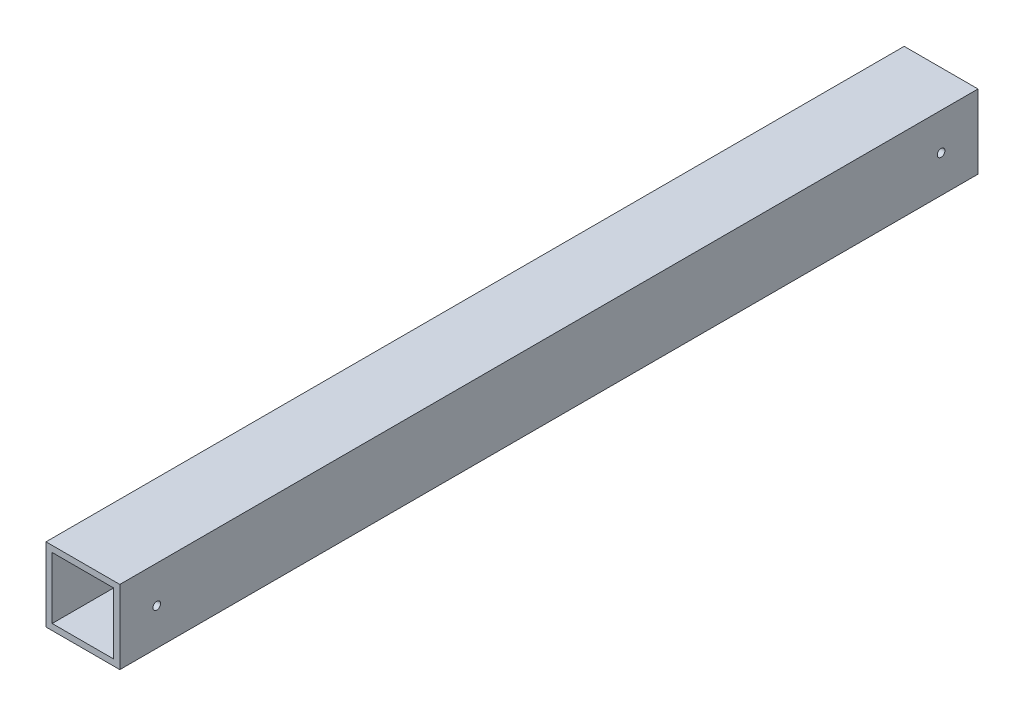
ISO-10303-21;
HEADER;
FILE_DESCRIPTION(('STEP AP214'),'2;1');
FILE_NAME('part.step','',(''),(''),'','','');
FILE_SCHEMA(('AUTOMOTIVE_DESIGN { 1 0 10303 214 1 1 1 1 }'));
ENDSEC;
DATA;
#1=APPLICATION_CONTEXT('core data for automotive mechanical design processes');
#2=APPLICATION_PROTOCOL_DEFINITION('international standard','automotive_design',2000,#1);
#3=PRODUCT_CONTEXT('',#1,'mechanical');
#4=PRODUCT('Part','Part','',(#3));
#5=PRODUCT_RELATED_PRODUCT_CATEGORY('part','',(#4));
#6=PRODUCT_DEFINITION_FORMATION('','',#4);
#7=PRODUCT_DEFINITION_CONTEXT('part definition',#1,'design');
#8=PRODUCT_DEFINITION('design','',#6,#7);
#9=PRODUCT_DEFINITION_SHAPE('','',#8);
#10=(LENGTH_UNIT() NAMED_UNIT(*) SI_UNIT(.MILLI.,.METRE.));
#11=(NAMED_UNIT(*) PLANE_ANGLE_UNIT() SI_UNIT($,.RADIAN.));
#12=(NAMED_UNIT(*) SI_UNIT($,.STERADIAN.) SOLID_ANGLE_UNIT());
#13=UNCERTAINTY_MEASURE_WITH_UNIT(LENGTH_MEASURE(1.E-05),#10,'distance_accuracy_value','');
#14=(GEOMETRIC_REPRESENTATION_CONTEXT(3) GLOBAL_UNCERTAINTY_ASSIGNED_CONTEXT((#13)) GLOBAL_UNIT_ASSIGNED_CONTEXT((#10,
#11,#12)) REPRESENTATION_CONTEXT('',''));
#15=CARTESIAN_POINT('',(0.,0.,0.));
#16=DIRECTION('',(0.,0.,1.));
#17=DIRECTION('',(1.,0.,0.));
#18=AXIS2_PLACEMENT_3D('',#15,#16,#17);
#19=CARTESIAN_POINT('',(0.,0.,139.5));
#20=DIRECTION('',(0.,0.,1.));
#21=DIRECTION('',(1.,0.,0.));
#22=AXIS2_PLACEMENT_3D('',#19,#20,#21);
#23=PLANE('',#22);
#24=DIRECTION('',(0.,-1.,0.));
#25=VECTOR('',#24,1.);
#26=CARTESIAN_POINT('',(-12.,12.,139.5));
#27=LINE('',#26,#25);
#28=CARTESIAN_POINT('',(-12.,12.,139.5));
#29=VERTEX_POINT('',#28);
#30=CARTESIAN_POINT('',(-12.,-12.,139.5));
#31=VERTEX_POINT('',#30);
#32=EDGE_CURVE('E140',#29,#31,#27,.T.);
#33=ORIENTED_EDGE('',*,*,#32,.T.);
#34=DIRECTION('',(1.,0.,0.));
#35=VECTOR('',#34,1.);
#36=CARTESIAN_POINT('',(-12.,-12.,139.5));
#37=LINE('',#36,#35);
#38=CARTESIAN_POINT('',(12.,-12.,139.5));
#39=VERTEX_POINT('',#38);
#40=EDGE_CURVE('E143',#31,#39,#37,.T.);
#41=ORIENTED_EDGE('',*,*,#40,.T.);
#42=DIRECTION('',(0.,1.,0.));
#43=VECTOR('',#42,1.);
#44=CARTESIAN_POINT('',(12.,12.,139.5));
#45=LINE('',#44,#43);
#46=CARTESIAN_POINT('',(12.,12.,139.5));
#47=VERTEX_POINT('',#46);
#48=EDGE_CURVE('E146',#39,#47,#45,.T.);
#49=ORIENTED_EDGE('',*,*,#48,.T.);
#50=DIRECTION('',(-1.,0.,0.));
#51=VECTOR('',#50,1.);
#52=CARTESIAN_POINT('',(-12.,12.,139.5));
#53=LINE('',#52,#51);
#54=EDGE_CURVE('E148',#47,#29,#53,.T.);
#55=ORIENTED_EDGE('',*,*,#54,.T.);
#56=EDGE_LOOP('',(#33,#41,#49,#55));
#57=FACE_BOUND('',#56,.T.);
#58=DIRECTION('',(-1.,0.,0.));
#59=VECTOR('',#58,1.);
#60=CARTESIAN_POINT('',(-10.,10.,139.5));
#61=LINE('',#60,#59);
#62=CARTESIAN_POINT('',(10.,10.,139.5));
#63=VERTEX_POINT('',#62);
#64=CARTESIAN_POINT('',(-10.,10.,139.5));
#65=VERTEX_POINT('',#64);
#66=EDGE_CURVE('E110',#63,#65,#61,.T.);
#67=ORIENTED_EDGE('',*,*,#66,.F.);
#68=DIRECTION('',(0.,1.,0.));
#69=VECTOR('',#68,1.);
#70=CARTESIAN_POINT('',(10.,10.,139.5));
#71=LINE('',#70,#69);
#72=CARTESIAN_POINT('',(10.,-10.,139.5));
#73=VERTEX_POINT('',#72);
#74=EDGE_CURVE('E102',#73,#63,#71,.T.);
#75=ORIENTED_EDGE('',*,*,#74,.F.);
#76=DIRECTION('',(1.,0.,0.));
#77=VECTOR('',#76,1.);
#78=CARTESIAN_POINT('',(-10.,-10.,139.5));
#79=LINE('',#78,#77);
#80=CARTESIAN_POINT('',(-10.,-10.,139.5));
#81=VERTEX_POINT('',#80);
#82=EDGE_CURVE('E124',#81,#73,#79,.T.);
#83=ORIENTED_EDGE('',*,*,#82,.F.);
#84=DIRECTION('',(0.,-1.,0.));
#85=VECTOR('',#84,1.);
#86=CARTESIAN_POINT('',(-10.,10.,139.5));
#87=LINE('',#86,#85);
#88=EDGE_CURVE('E122',#65,#81,#87,.T.);
#89=ORIENTED_EDGE('',*,*,#88,.F.);
#90=EDGE_LOOP('',(#67,#75,#83,#89));
#91=FACE_BOUND('',#90,.T.);
#92=ADVANCED_FACE('F35',(#57,#91),#23,.T.);
#93=CARTESIAN_POINT('',(0.,0.,-139.5));
#94=DIRECTION('',(0.,0.,1.));
#95=DIRECTION('',(1.,0.,0.));
#96=AXIS2_PLACEMENT_3D('',#93,#94,#95);
#97=PLANE('',#96);
#98=DIRECTION('',(0.,-1.,0.));
#99=VECTOR('',#98,1.);
#100=CARTESIAN_POINT('',(-12.,12.,-139.5));
#101=LINE('',#100,#99);
#102=CARTESIAN_POINT('',(-12.,12.,-139.5));
#103=VERTEX_POINT('',#102);
#104=CARTESIAN_POINT('',(-12.,-12.,-139.5));
#105=VERTEX_POINT('',#104);
#106=EDGE_CURVE('E118',#103,#105,#101,.T.);
#107=ORIENTED_EDGE('',*,*,#106,.F.);
#108=DIRECTION('',(-1.,0.,0.));
#109=VECTOR('',#108,1.);
#110=CARTESIAN_POINT('',(-12.,12.,-139.5));
#111=LINE('',#110,#109);
#112=CARTESIAN_POINT('',(12.,12.,-139.5));
#113=VERTEX_POINT('',#112);
#114=EDGE_CURVE('E144',#113,#103,#111,.T.);
#115=ORIENTED_EDGE('',*,*,#114,.F.);
#116=DIRECTION('',(0.,1.,0.));
#117=VECTOR('',#116,1.);
#118=CARTESIAN_POINT('',(12.,12.,-139.5));
#119=LINE('',#118,#117);
#120=CARTESIAN_POINT('',(12.,-12.,-139.5));
#121=VERTEX_POINT('',#120);
#122=EDGE_CURVE('E155',#121,#113,#119,.T.);
#123=ORIENTED_EDGE('',*,*,#122,.F.);
#124=DIRECTION('',(1.,0.,0.));
#125=VECTOR('',#124,1.);
#126=CARTESIAN_POINT('',(-12.,-12.,-139.5));
#127=LINE('',#126,#125);
#128=EDGE_CURVE('E153',#105,#121,#127,.T.);
#129=ORIENTED_EDGE('',*,*,#128,.F.);
#130=EDGE_LOOP('',(#107,#115,#123,#129));
#131=FACE_BOUND('',#130,.T.);
#132=DIRECTION('',(0.,1.,0.));
#133=VECTOR('',#132,1.);
#134=CARTESIAN_POINT('',(10.,10.,-139.5));
#135=LINE('',#134,#133);
#136=CARTESIAN_POINT('',(10.,-10.,-139.5));
#137=VERTEX_POINT('',#136);
#138=CARTESIAN_POINT('',(10.,10.,-139.5));
#139=VERTEX_POINT('',#138);
#140=EDGE_CURVE('E60',#137,#139,#135,.T.);
#141=ORIENTED_EDGE('',*,*,#140,.T.);
#142=DIRECTION('',(-1.,0.,0.));
#143=VECTOR('',#142,1.);
#144=CARTESIAN_POINT('',(-10.,10.,-139.5));
#145=LINE('',#144,#143);
#146=CARTESIAN_POINT('',(-10.,10.,-139.5));
#147=VERTEX_POINT('',#146);
#148=EDGE_CURVE('E117',#139,#147,#145,.T.);
#149=ORIENTED_EDGE('',*,*,#148,.T.);
#150=DIRECTION('',(0.,-1.,0.));
#151=VECTOR('',#150,1.);
#152=CARTESIAN_POINT('',(-10.,10.,-139.5));
#153=LINE('',#152,#151);
#154=CARTESIAN_POINT('',(-10.,-10.,-139.5));
#155=VERTEX_POINT('',#154);
#156=EDGE_CURVE('E132',#147,#155,#153,.T.);
#157=ORIENTED_EDGE('',*,*,#156,.T.);
#158=DIRECTION('',(1.,0.,0.));
#159=VECTOR('',#158,1.);
#160=CARTESIAN_POINT('',(-10.,-10.,-139.5));
#161=LINE('',#160,#159);
#162=EDGE_CURVE('E111',#155,#137,#161,.T.);
#163=ORIENTED_EDGE('',*,*,#162,.T.);
#164=EDGE_LOOP('',(#141,#149,#157,#163));
#165=FACE_BOUND('',#164,.T.);
#166=ADVANCED_FACE('F193',(#131,#165),#97,.F.);
#167=CARTESIAN_POINT('',(-12.,12.,139.5));
#168=DIRECTION('',(1.,0.,0.));
#169=DIRECTION('',(0.,1.,0.));
#170=AXIS2_PLACEMENT_3D('',#167,#168,#169);
#171=PLANE('',#170);
#172=CARTESIAN_POINT('',(-12.,0.,127.5));
#173=DIRECTION('',(-1.,0.,0.));
#174=DIRECTION('',(0.,0.,1.));
#175=AXIS2_PLACEMENT_3D('',#172,#173,#174);
#176=CIRCLE('',#175,1.24999999999999);
#177=CARTESIAN_POINT('',(-12.,0.,128.75));
#178=VERTEX_POINT('',#177);
#179=EDGE_CURVE('E184',#178,#178,#176,.T.);
#180=ORIENTED_EDGE('',*,*,#179,.F.);
#181=EDGE_LOOP('',(#180));
#182=FACE_BOUND('',#181,.T.);
#183=CARTESIAN_POINT('',(-12.,0.,-127.5));
#184=DIRECTION('',(-1.,0.,0.));
#185=DIRECTION('',(0.,0.,1.));
#186=AXIS2_PLACEMENT_3D('',#183,#184,#185);
#187=CIRCLE('',#186,1.24999999999999);
#188=CARTESIAN_POINT('',(-12.,0.,-126.25));
#189=VERTEX_POINT('',#188);
#190=EDGE_CURVE('E171',#189,#189,#187,.T.);
#191=ORIENTED_EDGE('',*,*,#190,.F.);
#192=EDGE_LOOP('',(#191));
#193=FACE_BOUND('',#192,.T.);
#194=ORIENTED_EDGE('',*,*,#106,.T.);
#195=DIRECTION('',(0.,0.,-1.));
#196=VECTOR('',#195,1.);
#197=CARTESIAN_POINT('',(-12.,-12.,139.5));
#198=LINE('',#197,#196);
#199=EDGE_CURVE('E11',#31,#105,#198,.T.);
#200=ORIENTED_EDGE('',*,*,#199,.F.);
#201=ORIENTED_EDGE('',*,*,#32,.F.);
#202=DIRECTION('',(0.,0.,-1.));
#203=VECTOR('',#202,1.);
#204=CARTESIAN_POINT('',(-12.,12.,139.5));
#205=LINE('',#204,#203);
#206=EDGE_CURVE('E150',#29,#103,#205,.T.);
#207=ORIENTED_EDGE('',*,*,#206,.T.);
#208=EDGE_LOOP('',(#194,#200,#201,#207));
#209=FACE_BOUND('',#208,.T.);
#210=ADVANCED_FACE('F37',(#182,#193,#209),#171,.F.);
#211=CARTESIAN_POINT('',(-12.,-12.,139.5));
#212=DIRECTION('',(0.,1.,0.));
#213=DIRECTION('',(-1.,0.,0.));
#214=AXIS2_PLACEMENT_3D('',#211,#212,#213);
#215=PLANE('',#214);
#216=ORIENTED_EDGE('',*,*,#128,.T.);
#217=DIRECTION('',(0.,0.,-1.));
#218=VECTOR('',#217,1.);
#219=CARTESIAN_POINT('',(12.,-12.,139.5));
#220=LINE('',#219,#218);
#221=EDGE_CURVE('E44',#39,#121,#220,.T.);
#222=ORIENTED_EDGE('',*,*,#221,.F.);
#223=ORIENTED_EDGE('',*,*,#40,.F.);
#224=ORIENTED_EDGE('',*,*,#199,.T.);
#225=EDGE_LOOP('',(#216,#222,#223,#224));
#226=FACE_BOUND('',#225,.T.);
#227=ADVANCED_FACE('F192',(#226),#215,.F.);
#228=CARTESIAN_POINT('',(12.,12.,139.5));
#229=DIRECTION('',(-1.,0.,0.));
#230=DIRECTION('',(0.,-1.,0.));
#231=AXIS2_PLACEMENT_3D('',#228,#229,#230);
#232=PLANE('',#231);
#233=CARTESIAN_POINT('',(12.,0.,127.5));
#234=DIRECTION('',(-1.,0.,0.));
#235=DIRECTION('',(0.,0.,1.));
#236=AXIS2_PLACEMENT_3D('',#233,#234,#235);
#237=CIRCLE('',#236,1.24999999999998);
#238=CARTESIAN_POINT('',(12.,0.,128.75));
#239=VERTEX_POINT('',#238);
#240=EDGE_CURVE('E181',#239,#239,#237,.T.);
#241=ORIENTED_EDGE('',*,*,#240,.T.);
#242=EDGE_LOOP('',(#241));
#243=FACE_BOUND('',#242,.T.);
#244=CARTESIAN_POINT('',(12.,0.,-127.5));
#245=DIRECTION('',(-1.,0.,0.));
#246=DIRECTION('',(0.,0.,1.));
#247=AXIS2_PLACEMENT_3D('',#244,#245,#246);
#248=CIRCLE('',#247,1.24999999999998);
#249=CARTESIAN_POINT('',(12.,0.,-126.25));
#250=VERTEX_POINT('',#249);
#251=EDGE_CURVE('E166',#250,#250,#248,.T.);
#252=ORIENTED_EDGE('',*,*,#251,.T.);
#253=EDGE_LOOP('',(#252));
#254=FACE_BOUND('',#253,.T.);
#255=ORIENTED_EDGE('',*,*,#122,.T.);
#256=DIRECTION('',(0.,0.,-1.));
#257=VECTOR('',#256,1.);
#258=CARTESIAN_POINT('',(12.,12.,139.5));
#259=LINE('',#258,#257);
#260=EDGE_CURVE('E160',#47,#113,#259,.T.);
#261=ORIENTED_EDGE('',*,*,#260,.F.);
#262=ORIENTED_EDGE('',*,*,#48,.F.);
#263=ORIENTED_EDGE('',*,*,#221,.T.);
#264=EDGE_LOOP('',(#255,#261,#262,#263));
#265=FACE_BOUND('',#264,.T.);
#266=ADVANCED_FACE('F213',(#243,#254,#265),#232,.F.);
#267=CARTESIAN_POINT('',(-12.,12.,139.5));
#268=DIRECTION('',(0.,-1.,0.));
#269=DIRECTION('',(0.,0.,-1.));
#270=AXIS2_PLACEMENT_3D('',#267,#268,#269);
#271=PLANE('',#270);
#272=ORIENTED_EDGE('',*,*,#114,.T.);
#273=ORIENTED_EDGE('',*,*,#206,.F.);
#274=ORIENTED_EDGE('',*,*,#54,.F.);
#275=ORIENTED_EDGE('',*,*,#260,.T.);
#276=EDGE_LOOP('',(#272,#273,#274,#275));
#277=FACE_BOUND('',#276,.T.);
#278=ADVANCED_FACE('F211',(#277),#271,.F.);
#279=CARTESIAN_POINT('',(10.,10.,139.5));
#280=DIRECTION('',(-1.,0.,0.));
#281=DIRECTION('',(0.,0.,1.));
#282=AXIS2_PLACEMENT_3D('',#279,#280,#281);
#283=PLANE('',#282);
#284=CARTESIAN_POINT('',(10.,0.,127.5));
#285=DIRECTION('',(-1.,0.,0.));
#286=DIRECTION('',(0.,0.,1.));
#287=AXIS2_PLACEMENT_3D('',#284,#285,#286);
#288=CIRCLE('',#287,1.24999999999999);
#289=CARTESIAN_POINT('',(10.,0.,128.75));
#290=VERTEX_POINT('',#289);
#291=EDGE_CURVE('E176',#290,#290,#288,.T.);
#292=ORIENTED_EDGE('',*,*,#291,.F.);
#293=EDGE_LOOP('',(#292));
#294=FACE_BOUND('',#293,.T.);
#295=CARTESIAN_POINT('',(10.,0.,-127.5));
#296=DIRECTION('',(-1.,0.,0.));
#297=DIRECTION('',(0.,0.,1.));
#298=AXIS2_PLACEMENT_3D('',#295,#296,#297);
#299=CIRCLE('',#298,1.24999999999999);
#300=CARTESIAN_POINT('',(10.,0.,-126.25));
#301=VERTEX_POINT('',#300);
#302=EDGE_CURVE('E130',#301,#301,#299,.T.);
#303=ORIENTED_EDGE('',*,*,#302,.F.);
#304=EDGE_LOOP('',(#303));
#305=FACE_BOUND('',#304,.T.);
#306=ORIENTED_EDGE('',*,*,#140,.F.);
#307=DIRECTION('',(0.,0.,-1.));
#308=VECTOR('',#307,1.);
#309=CARTESIAN_POINT('',(10.,-10.,139.5));
#310=LINE('',#309,#308);
#311=EDGE_CURVE('E106',#73,#137,#310,.T.);
#312=ORIENTED_EDGE('',*,*,#311,.F.);
#313=ORIENTED_EDGE('',*,*,#74,.T.);
#314=DIRECTION('',(0.,0.,-1.));
#315=VECTOR('',#314,1.);
#316=CARTESIAN_POINT('',(10.,10.,139.5));
#317=LINE('',#316,#315);
#318=EDGE_CURVE('E105',#63,#139,#317,.T.);
#319=ORIENTED_EDGE('',*,*,#318,.T.);
#320=EDGE_LOOP('',(#306,#312,#313,#319));
#321=FACE_BOUND('',#320,.T.);
#322=ADVANCED_FACE('F104',(#294,#305,#321),#283,.T.);
#323=CARTESIAN_POINT('',(-10.,10.,139.5));
#324=DIRECTION('',(0.,-1.,0.));
#325=DIRECTION('',(0.,0.,-1.));
#326=AXIS2_PLACEMENT_3D('',#323,#324,#325);
#327=PLANE('',#326);
#328=ORIENTED_EDGE('',*,*,#148,.F.);
#329=ORIENTED_EDGE('',*,*,#318,.F.);
#330=ORIENTED_EDGE('',*,*,#66,.T.);
#331=DIRECTION('',(0.,0.,-1.));
#332=VECTOR('',#331,1.);
#333=CARTESIAN_POINT('',(-10.,10.,139.5));
#334=LINE('',#333,#332);
#335=EDGE_CURVE('E119',#65,#147,#334,.T.);
#336=ORIENTED_EDGE('',*,*,#335,.T.);
#337=EDGE_LOOP('',(#328,#329,#330,#336));
#338=FACE_BOUND('',#337,.T.);
#339=ADVANCED_FACE('F114',(#338),#327,.T.);
#340=CARTESIAN_POINT('',(-10.,10.,139.5));
#341=DIRECTION('',(1.,0.,0.));
#342=DIRECTION('',(0.,1.,0.));
#343=AXIS2_PLACEMENT_3D('',#340,#341,#342);
#344=PLANE('',#343);
#345=CARTESIAN_POINT('',(-10.,0.,127.5));
#346=DIRECTION('',(1.,0.,0.));
#347=DIRECTION('',(0.,1.,0.));
#348=AXIS2_PLACEMENT_3D('',#345,#346,#347);
#349=CIRCLE('',#348,1.24999999999999);
#350=CARTESIAN_POINT('',(-10.,1.24999999999998,127.5));
#351=VERTEX_POINT('',#350);
#352=EDGE_CURVE('E39',#351,#351,#349,.T.);
#353=ORIENTED_EDGE('',*,*,#352,.F.);
#354=EDGE_LOOP('',(#353));
#355=FACE_BOUND('',#354,.T.);
#356=CARTESIAN_POINT('',(-10.,0.,-127.5));
#357=DIRECTION('',(1.,0.,0.));
#358=DIRECTION('',(0.,1.,0.));
#359=AXIS2_PLACEMENT_3D('',#356,#357,#358);
#360=CIRCLE('',#359,1.24999999999999);
#361=CARTESIAN_POINT('',(-10.,1.24999999999998,-127.5));
#362=VERTEX_POINT('',#361);
#363=EDGE_CURVE('E164',#362,#362,#360,.T.);
#364=ORIENTED_EDGE('',*,*,#363,.F.);
#365=EDGE_LOOP('',(#364));
#366=FACE_BOUND('',#365,.T.);
#367=ORIENTED_EDGE('',*,*,#156,.F.);
#368=ORIENTED_EDGE('',*,*,#335,.F.);
#369=ORIENTED_EDGE('',*,*,#88,.T.);
#370=DIRECTION('',(0.,0.,-1.));
#371=VECTOR('',#370,1.);
#372=CARTESIAN_POINT('',(-10.,-10.,139.5));
#373=LINE('',#372,#371);
#374=EDGE_CURVE('E52',#81,#155,#373,.T.);
#375=ORIENTED_EDGE('',*,*,#374,.T.);
#376=EDGE_LOOP('',(#367,#368,#369,#375));
#377=FACE_BOUND('',#376,.T.);
#378=ADVANCED_FACE('F234',(#355,#366,#377),#344,.T.);
#379=CARTESIAN_POINT('',(-10.,-10.,139.5));
#380=DIRECTION('',(0.,1.,0.));
#381=DIRECTION('',(0.,0.,1.));
#382=AXIS2_PLACEMENT_3D('',#379,#380,#381);
#383=PLANE('',#382);
#384=ORIENTED_EDGE('',*,*,#162,.F.);
#385=ORIENTED_EDGE('',*,*,#374,.F.);
#386=ORIENTED_EDGE('',*,*,#82,.T.);
#387=ORIENTED_EDGE('',*,*,#311,.T.);
#388=EDGE_LOOP('',(#384,#385,#386,#387));
#389=FACE_BOUND('',#388,.T.);
#390=ADVANCED_FACE('F237',(#389),#383,.T.);
#391=CARTESIAN_POINT('',(-12.,0.,-127.5));
#392=DIRECTION('',(-1.,0.,0.));
#393=DIRECTION('',(0.,0.,1.));
#394=AXIS2_PLACEMENT_3D('',#391,#392,#393);
#395=CYLINDRICAL_SURFACE('',#394,1.24999999999999);
#396=ORIENTED_EDGE('',*,*,#363,.T.);
#397=EDGE_LOOP('',(#396));
#398=FACE_BOUND('',#397,.T.);
#399=ORIENTED_EDGE('',*,*,#190,.T.);
#400=EDGE_LOOP('',(#399));
#401=FACE_BOUND('',#400,.T.);
#402=ADVANCED_FACE('F241',(#398,#401),#395,.F.);
#403=ORIENTED_EDGE('',*,*,#302,.T.);
#404=EDGE_LOOP('',(#403));
#405=FACE_BOUND('',#404,.T.);
#406=ORIENTED_EDGE('',*,*,#251,.F.);
#407=EDGE_LOOP('',(#406));
#408=FACE_BOUND('',#407,.T.);
#409=ADVANCED_FACE('F244',(#405,#408),#395,.F.);
#410=CARTESIAN_POINT('',(-12.,0.,127.5));
#411=DIRECTION('',(-1.,0.,0.));
#412=DIRECTION('',(0.,0.,1.));
#413=AXIS2_PLACEMENT_3D('',#410,#411,#412);
#414=CYLINDRICAL_SURFACE('',#413,1.24999999999999);
#415=ORIENTED_EDGE('',*,*,#352,.T.);
#416=EDGE_LOOP('',(#415));
#417=FACE_BOUND('',#416,.T.);
#418=ORIENTED_EDGE('',*,*,#179,.T.);
#419=EDGE_LOOP('',(#418));
#420=FACE_BOUND('',#419,.T.);
#421=ADVANCED_FACE('F188',(#417,#420),#414,.F.);
#422=ORIENTED_EDGE('',*,*,#291,.T.);
#423=EDGE_LOOP('',(#422));
#424=FACE_BOUND('',#423,.T.);
#425=ORIENTED_EDGE('',*,*,#240,.F.);
#426=EDGE_LOOP('',(#425));
#427=FACE_BOUND('',#426,.T.);
#428=ADVANCED_FACE('F246',(#424,#427),#414,.F.);
#429=CLOSED_SHELL('',(#92,#166,#210,#227,#266,#278,#322,#339,#378,#390,#402,#409,#421,#428));
#430=MANIFOLD_SOLID_BREP('B2',#429);
#431=ADVANCED_BREP_SHAPE_REPRESENTATION('',(#18,#430),#14);
#432=SHAPE_DEFINITION_REPRESENTATION(#9,#431);
ENDSEC;
END-ISO-10303-21;
